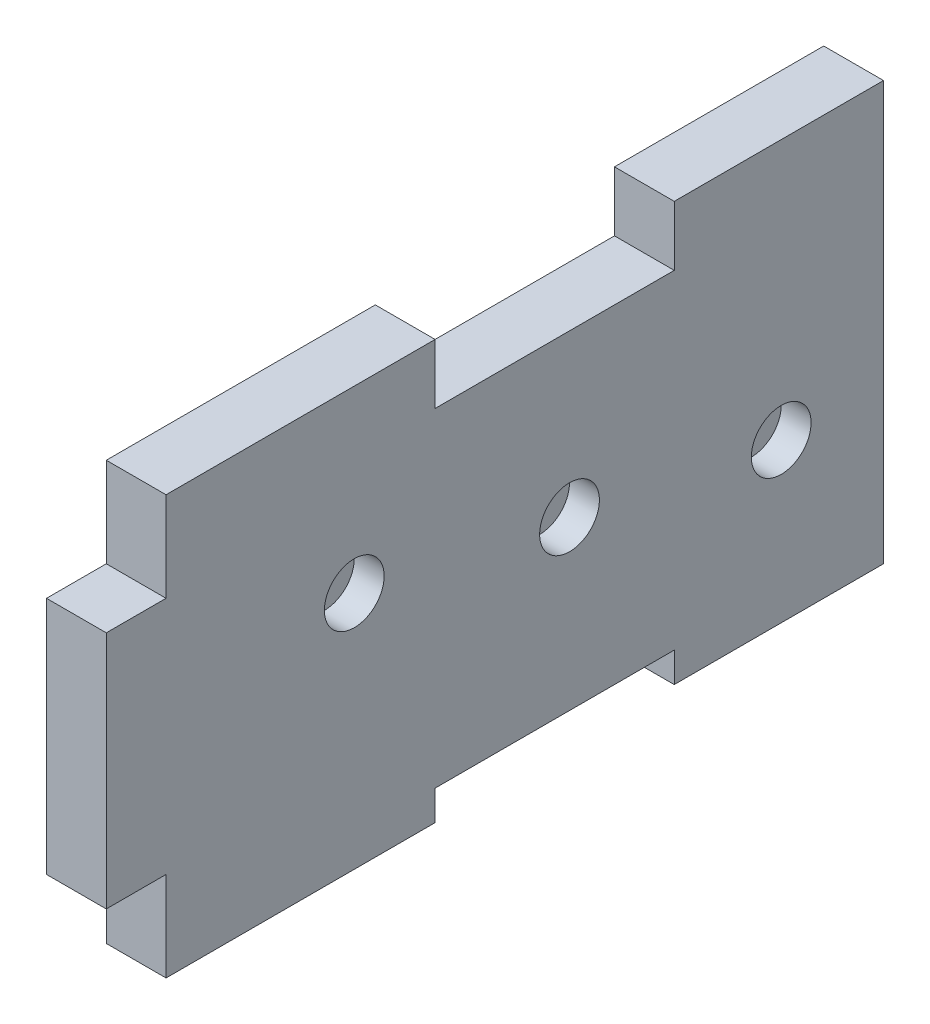
ISO-10303-21;
HEADER;
FILE_DESCRIPTION(('STEP AP214'),'2;1');
FILE_NAME('part.step','',(''),(''),'','','');
FILE_SCHEMA(('AUTOMOTIVE_DESIGN { 1 0 10303 214 1 1 1 1 }'));
ENDSEC;
DATA;
#1=APPLICATION_CONTEXT('core data for automotive mechanical design processes');
#2=APPLICATION_PROTOCOL_DEFINITION('international standard','automotive_design',2000,#1);
#3=PRODUCT_CONTEXT('',#1,'mechanical');
#4=PRODUCT('Part','Part','',(#3));
#5=PRODUCT_RELATED_PRODUCT_CATEGORY('part','',(#4));
#6=PRODUCT_DEFINITION_FORMATION('','',#4);
#7=PRODUCT_DEFINITION_CONTEXT('part definition',#1,'design');
#8=PRODUCT_DEFINITION('design','',#6,#7);
#9=PRODUCT_DEFINITION_SHAPE('','',#8);
#10=(LENGTH_UNIT() NAMED_UNIT(*) SI_UNIT(.MILLI.,.METRE.));
#11=(NAMED_UNIT(*) PLANE_ANGLE_UNIT() SI_UNIT($,.RADIAN.));
#12=(NAMED_UNIT(*) SI_UNIT($,.STERADIAN.) SOLID_ANGLE_UNIT());
#13=UNCERTAINTY_MEASURE_WITH_UNIT(LENGTH_MEASURE(1.E-05),#10,'distance_accuracy_value','');
#14=(GEOMETRIC_REPRESENTATION_CONTEXT(3) GLOBAL_UNCERTAINTY_ASSIGNED_CONTEXT((#13)) GLOBAL_UNIT_ASSIGNED_CONTEXT((#10,
#11,#12)) REPRESENTATION_CONTEXT('',''));
#15=CARTESIAN_POINT('',(0.,0.,0.));
#16=DIRECTION('',(0.,0.,1.));
#17=DIRECTION('',(1.,0.,0.));
#18=AXIS2_PLACEMENT_3D('',#15,#16,#17);
#19=CARTESIAN_POINT('',(5.,0.,35.));
#20=DIRECTION('',(0.,0.,1.));
#21=DIRECTION('',(1.,0.,0.));
#22=AXIS2_PLACEMENT_3D('',#19,#20,#21);
#23=PLANE('',#22);
#24=DIRECTION('',(-1.,0.,0.));
#25=VECTOR('',#24,1.);
#26=CARTESIAN_POINT('',(5.,5.00000000000002,35.));
#27=LINE('',#26,#25);
#28=CARTESIAN_POINT('',(5.,5.00000000000002,35.));
#29=VERTEX_POINT('',#28);
#30=CARTESIAN_POINT('',(-5.,5.00000000000002,35.));
#31=VERTEX_POINT('',#30);
#32=EDGE_CURVE('E158',#29,#31,#27,.T.);
#33=ORIENTED_EDGE('',*,*,#32,.T.);
#34=DIRECTION('',(0.,1.,0.));
#35=VECTOR('',#34,1.);
#36=CARTESIAN_POINT('',(-5.,0.,35.));
#37=LINE('',#36,#35);
#38=CARTESIAN_POINT('',(-5.,0.,35.));
#39=VERTEX_POINT('',#38);
#40=EDGE_CURVE('E157',#39,#31,#37,.T.);
#41=ORIENTED_EDGE('',*,*,#40,.F.);
#42=DIRECTION('',(-1.,0.,0.));
#43=VECTOR('',#42,1.);
#44=CARTESIAN_POINT('',(5.,0.,35.));
#45=LINE('',#44,#43);
#46=CARTESIAN_POINT('',(5.,0.,35.));
#47=VERTEX_POINT('',#46);
#48=EDGE_CURVE('E11',#47,#39,#45,.T.);
#49=ORIENTED_EDGE('',*,*,#48,.F.);
#50=DIRECTION('',(0.,1.,0.));
#51=VECTOR('',#50,1.);
#52=CARTESIAN_POINT('',(5.,0.,35.));
#53=LINE('',#52,#51);
#54=EDGE_CURVE('E220',#47,#29,#53,.T.);
#55=ORIENTED_EDGE('',*,*,#54,.T.);
#56=EDGE_LOOP('',(#33,#41,#49,#55));
#57=FACE_BOUND('',#56,.T.);
#58=ADVANCED_FACE('F37',(#57),#23,.T.);
#59=CARTESIAN_POINT('',(5.,0.,0.));
#60=DIRECTION('',(0.,1.,0.));
#61=DIRECTION('',(0.,0.,1.));
#62=AXIS2_PLACEMENT_3D('',#59,#60,#61);
#63=PLANE('',#62);
#64=ORIENTED_EDGE('',*,*,#48,.T.);
#65=DIRECTION('',(0.,0.,1.));
#66=VECTOR('',#65,1.);
#67=CARTESIAN_POINT('',(-5.,0.,0.));
#68=LINE('',#67,#66);
#69=CARTESIAN_POINT('',(-5.,0.,0.));
#70=VERTEX_POINT('',#69);
#71=EDGE_CURVE('E152',#70,#39,#68,.T.);
#72=ORIENTED_EDGE('',*,*,#71,.F.);
#73=DIRECTION('',(-1.,0.,0.));
#74=VECTOR('',#73,1.);
#75=CARTESIAN_POINT('',(5.,0.,0.));
#76=LINE('',#75,#74);
#77=CARTESIAN_POINT('',(5.,0.,0.));
#78=VERTEX_POINT('',#77);
#79=EDGE_CURVE('E44',#78,#70,#76,.T.);
#80=ORIENTED_EDGE('',*,*,#79,.F.);
#81=DIRECTION('',(0.,0.,-1.));
#82=VECTOR('',#81,1.);
#83=CARTESIAN_POINT('',(5.,0.,0.));
#84=LINE('',#83,#82);
#85=EDGE_CURVE('E153',#47,#78,#84,.T.);
#86=ORIENTED_EDGE('',*,*,#85,.F.);
#87=EDGE_LOOP('',(#64,#72,#80,#86));
#88=FACE_BOUND('',#87,.T.);
#89=ADVANCED_FACE('F149',(#88),#63,.F.);
#90=CARTESIAN_POINT('',(5.,0.,0.));
#91=DIRECTION('',(0.,0.,-1.));
#92=DIRECTION('',(0.,1.,0.));
#93=AXIS2_PLACEMENT_3D('',#90,#91,#92);
#94=PLANE('',#93);
#95=ORIENTED_EDGE('',*,*,#79,.T.);
#96=DIRECTION('',(0.,-1.,0.));
#97=VECTOR('',#96,1.);
#98=CARTESIAN_POINT('',(-5.,70.,0.));
#99=LINE('',#98,#97);
#100=CARTESIAN_POINT('',(-5.,70.,0.));
#101=VERTEX_POINT('',#100);
#102=EDGE_CURVE('E168',#101,#70,#99,.T.);
#103=ORIENTED_EDGE('',*,*,#102,.F.);
#104=DIRECTION('',(-1.,0.,0.));
#105=VECTOR('',#104,1.);
#106=CARTESIAN_POINT('',(5.,70.,0.));
#107=LINE('',#106,#105);
#108=CARTESIAN_POINT('',(5.,70.,0.));
#109=VERTEX_POINT('',#108);
#110=EDGE_CURVE('E284',#109,#101,#107,.T.);
#111=ORIENTED_EDGE('',*,*,#110,.F.);
#112=DIRECTION('',(0.,-1.,0.));
#113=VECTOR('',#112,1.);
#114=CARTESIAN_POINT('',(5.,0.,0.));
#115=LINE('',#114,#113);
#116=EDGE_CURVE('E229',#109,#78,#115,.T.);
#117=ORIENTED_EDGE('',*,*,#116,.T.);
#118=EDGE_LOOP('',(#95,#103,#111,#117));
#119=FACE_BOUND('',#118,.T.);
#120=ADVANCED_FACE('F286',(#119),#94,.T.);
#121=CARTESIAN_POINT('',(5.,70.,0.));
#122=DIRECTION('',(0.,1.,0.));
#123=DIRECTION('',(0.,0.,1.));
#124=AXIS2_PLACEMENT_3D('',#121,#122,#123);
#125=PLANE('',#124);
#126=ORIENTED_EDGE('',*,*,#110,.T.);
#127=DIRECTION('',(0.,0.,-1.));
#128=VECTOR('',#127,1.);
#129=CARTESIAN_POINT('',(-5.,70.,35.));
#130=LINE('',#129,#128);
#131=CARTESIAN_POINT('',(-5.,70.,35.));
#132=VERTEX_POINT('',#131);
#133=EDGE_CURVE('E205',#132,#101,#130,.T.);
#134=ORIENTED_EDGE('',*,*,#133,.F.);
#135=DIRECTION('',(-1.,0.,0.));
#136=VECTOR('',#135,1.);
#137=CARTESIAN_POINT('',(5.,70.,35.));
#138=LINE('',#137,#136);
#139=CARTESIAN_POINT('',(5.,70.,35.));
#140=VERTEX_POINT('',#139);
#141=EDGE_CURVE('E282',#140,#132,#138,.T.);
#142=ORIENTED_EDGE('',*,*,#141,.F.);
#143=DIRECTION('',(0.,0.,-1.));
#144=VECTOR('',#143,1.);
#145=CARTESIAN_POINT('',(5.,70.,0.));
#146=LINE('',#145,#144);
#147=EDGE_CURVE('E233',#140,#109,#146,.T.);
#148=ORIENTED_EDGE('',*,*,#147,.T.);
#149=EDGE_LOOP('',(#126,#134,#142,#148));
#150=FACE_BOUND('',#149,.T.);
#151=ADVANCED_FACE('F291',(#150),#125,.T.);
#152=CARTESIAN_POINT('',(5.,0.,35.));
#153=DIRECTION('',(0.,0.,-1.));
#154=DIRECTION('',(-1.,0.,0.));
#155=AXIS2_PLACEMENT_3D('',#152,#153,#154);
#156=PLANE('',#155);
#157=ORIENTED_EDGE('',*,*,#141,.T.);
#158=DIRECTION('',(0.,1.,0.));
#159=VECTOR('',#158,1.);
#160=CARTESIAN_POINT('',(-5.,60.,35.));
#161=LINE('',#160,#159);
#162=CARTESIAN_POINT('',(-5.,60.,35.));
#163=VERTEX_POINT('',#162);
#164=EDGE_CURVE('E202',#163,#132,#161,.T.);
#165=ORIENTED_EDGE('',*,*,#164,.F.);
#166=DIRECTION('',(-1.,0.,0.));
#167=VECTOR('',#166,1.);
#168=CARTESIAN_POINT('',(5.,60.,35.));
#169=LINE('',#168,#167);
#170=CARTESIAN_POINT('',(5.,60.,35.));
#171=VERTEX_POINT('',#170);
#172=EDGE_CURVE('E280',#171,#163,#169,.T.);
#173=ORIENTED_EDGE('',*,*,#172,.F.);
#174=DIRECTION('',(0.,-1.,0.));
#175=VECTOR('',#174,1.);
#176=CARTESIAN_POINT('',(5.,0.,35.));
#177=LINE('',#176,#175);
#178=EDGE_CURVE('E236',#140,#171,#177,.T.);
#179=ORIENTED_EDGE('',*,*,#178,.F.);
#180=EDGE_LOOP('',(#157,#165,#173,#179));
#181=FACE_BOUND('',#180,.T.);
#182=ADVANCED_FACE('F297',(#181),#156,.F.);
#183=CARTESIAN_POINT('',(5.,60.,0.));
#184=DIRECTION('',(0.,1.,0.));
#185=DIRECTION('',(0.,0.,1.));
#186=AXIS2_PLACEMENT_3D('',#183,#184,#185);
#187=PLANE('',#186);
#188=ORIENTED_EDGE('',*,*,#172,.T.);
#189=DIRECTION('',(0.,0.,-1.));
#190=VECTOR('',#189,1.);
#191=CARTESIAN_POINT('',(-5.,60.,75.));
#192=LINE('',#191,#190);
#193=CARTESIAN_POINT('',(-5.,60.,75.));
#194=VERTEX_POINT('',#193);
#195=EDGE_CURVE('E199',#194,#163,#192,.T.);
#196=ORIENTED_EDGE('',*,*,#195,.F.);
#197=DIRECTION('',(-1.,0.,0.));
#198=VECTOR('',#197,1.);
#199=CARTESIAN_POINT('',(5.,60.,75.));
#200=LINE('',#199,#198);
#201=CARTESIAN_POINT('',(5.,60.,75.));
#202=VERTEX_POINT('',#201);
#203=EDGE_CURVE('E278',#202,#194,#200,.T.);
#204=ORIENTED_EDGE('',*,*,#203,.F.);
#205=DIRECTION('',(0.,0.,-1.));
#206=VECTOR('',#205,1.);
#207=CARTESIAN_POINT('',(5.,60.,0.));
#208=LINE('',#207,#206);
#209=EDGE_CURVE('E239',#202,#171,#208,.T.);
#210=ORIENTED_EDGE('',*,*,#209,.T.);
#211=EDGE_LOOP('',(#188,#196,#204,#210));
#212=FACE_BOUND('',#211,.T.);
#213=ADVANCED_FACE('F381',(#212),#187,.T.);
#214=CARTESIAN_POINT('',(5.,0.,75.));
#215=DIRECTION('',(0.,0.,-1.));
#216=DIRECTION('',(-1.,0.,0.));
#217=AXIS2_PLACEMENT_3D('',#214,#215,#216);
#218=PLANE('',#217);
#219=ORIENTED_EDGE('',*,*,#203,.T.);
#220=DIRECTION('',(0.,-1.,0.));
#221=VECTOR('',#220,1.);
#222=CARTESIAN_POINT('',(-5.,70.,75.));
#223=LINE('',#222,#221);
#224=CARTESIAN_POINT('',(-5.,70.,75.));
#225=VERTEX_POINT('',#224);
#226=EDGE_CURVE('E196',#225,#194,#223,.T.);
#227=ORIENTED_EDGE('',*,*,#226,.F.);
#228=DIRECTION('',(-1.,0.,0.));
#229=VECTOR('',#228,1.);
#230=CARTESIAN_POINT('',(5.,70.,75.));
#231=LINE('',#230,#229);
#232=CARTESIAN_POINT('',(5.,70.,75.));
#233=VERTEX_POINT('',#232);
#234=EDGE_CURVE('E276',#233,#225,#231,.T.);
#235=ORIENTED_EDGE('',*,*,#234,.F.);
#236=DIRECTION('',(0.,-1.,0.));
#237=VECTOR('',#236,1.);
#238=CARTESIAN_POINT('',(5.,0.,75.));
#239=LINE('',#238,#237);
#240=EDGE_CURVE('E242',#233,#202,#239,.T.);
#241=ORIENTED_EDGE('',*,*,#240,.T.);
#242=EDGE_LOOP('',(#219,#227,#235,#241));
#243=FACE_BOUND('',#242,.T.);
#244=ADVANCED_FACE('F304',(#243),#218,.T.);
#245=ORIENTED_EDGE('',*,*,#234,.T.);
#246=DIRECTION('',(0.,0.,-1.));
#247=VECTOR('',#246,1.);
#248=CARTESIAN_POINT('',(-5.,70.,120.));
#249=LINE('',#248,#247);
#250=CARTESIAN_POINT('',(-5.,70.,120.));
#251=VERTEX_POINT('',#250);
#252=EDGE_CURVE('E193',#251,#225,#249,.T.);
#253=ORIENTED_EDGE('',*,*,#252,.F.);
#254=DIRECTION('',(-1.,0.,0.));
#255=VECTOR('',#254,1.);
#256=CARTESIAN_POINT('',(5.,70.,120.));
#257=LINE('',#256,#255);
#258=CARTESIAN_POINT('',(5.,70.,120.));
#259=VERTEX_POINT('',#258);
#260=EDGE_CURVE('E274',#259,#251,#257,.T.);
#261=ORIENTED_EDGE('',*,*,#260,.F.);
#262=EDGE_CURVE('E237',#259,#233,#146,.T.);
#263=ORIENTED_EDGE('',*,*,#262,.T.);
#264=EDGE_LOOP('',(#245,#253,#261,#263));
#265=FACE_BOUND('',#264,.T.);
#266=ADVANCED_FACE('F308',(#265),#125,.T.);
#267=CARTESIAN_POINT('',(5.,1.11022302462516E-13,120.));
#268=DIRECTION('',(0.,0.,-1.));
#269=DIRECTION('',(0.,1.,0.));
#270=AXIS2_PLACEMENT_3D('',#267,#268,#269);
#271=PLANE('',#270);
#272=ORIENTED_EDGE('',*,*,#260,.T.);
#273=DIRECTION('',(0.,1.,0.));
#274=VECTOR('',#273,1.);
#275=CARTESIAN_POINT('',(-5.,55.,120.));
#276=LINE('',#275,#274);
#277=CARTESIAN_POINT('',(-5.,55.,120.));
#278=VERTEX_POINT('',#277);
#279=EDGE_CURVE('E190',#278,#251,#276,.T.);
#280=ORIENTED_EDGE('',*,*,#279,.F.);
#281=DIRECTION('',(-1.,0.,0.));
#282=VECTOR('',#281,1.);
#283=CARTESIAN_POINT('',(5.,55.,120.));
#284=LINE('',#283,#282);
#285=CARTESIAN_POINT('',(5.,55.,120.));
#286=VERTEX_POINT('',#285);
#287=EDGE_CURVE('E272',#286,#278,#284,.T.);
#288=ORIENTED_EDGE('',*,*,#287,.F.);
#289=DIRECTION('',(0.,-1.,0.));
#290=VECTOR('',#289,1.);
#291=CARTESIAN_POINT('',(5.,1.11022302462516E-13,120.));
#292=LINE('',#291,#290);
#293=EDGE_CURVE('E245',#259,#286,#292,.T.);
#294=ORIENTED_EDGE('',*,*,#293,.F.);
#295=EDGE_LOOP('',(#272,#280,#288,#294));
#296=FACE_BOUND('',#295,.T.);
#297=ADVANCED_FACE('F314',(#296),#271,.F.);
#298=CARTESIAN_POINT('',(5.,54.9999999999999,0.));
#299=DIRECTION('',(0.,1.,0.));
#300=DIRECTION('',(0.,0.,1.));
#301=AXIS2_PLACEMENT_3D('',#298,#299,#300);
#302=PLANE('',#301);
#303=ORIENTED_EDGE('',*,*,#287,.T.);
#304=DIRECTION('',(0.,0.,-1.));
#305=VECTOR('',#304,1.);
#306=CARTESIAN_POINT('',(-5.,55.,130.));
#307=LINE('',#306,#305);
#308=CARTESIAN_POINT('',(-5.,55.,130.));
#309=VERTEX_POINT('',#308);
#310=EDGE_CURVE('E187',#309,#278,#307,.T.);
#311=ORIENTED_EDGE('',*,*,#310,.F.);
#312=DIRECTION('',(-1.,0.,0.));
#313=VECTOR('',#312,1.);
#314=CARTESIAN_POINT('',(5.,55.,130.));
#315=LINE('',#314,#313);
#316=CARTESIAN_POINT('',(5.,55.,130.));
#317=VERTEX_POINT('',#316);
#318=EDGE_CURVE('E270',#317,#309,#315,.T.);
#319=ORIENTED_EDGE('',*,*,#318,.F.);
#320=DIRECTION('',(0.,0.,-1.));
#321=VECTOR('',#320,1.);
#322=CARTESIAN_POINT('',(5.,54.9999999999999,0.));
#323=LINE('',#322,#321);
#324=EDGE_CURVE('E247',#317,#286,#323,.T.);
#325=ORIENTED_EDGE('',*,*,#324,.T.);
#326=EDGE_LOOP('',(#303,#311,#319,#325));
#327=FACE_BOUND('',#326,.T.);
#328=ADVANCED_FACE('F320',(#327),#302,.T.);
#329=CARTESIAN_POINT('',(5.,0.,130.));
#330=DIRECTION('',(0.,0.,-1.));
#331=DIRECTION('',(0.,1.,0.));
#332=AXIS2_PLACEMENT_3D('',#329,#330,#331);
#333=PLANE('',#332);
#334=ORIENTED_EDGE('',*,*,#318,.T.);
#335=DIRECTION('',(0.,1.,0.));
#336=VECTOR('',#335,1.);
#337=CARTESIAN_POINT('',(-5.,15.,130.));
#338=LINE('',#337,#336);
#339=CARTESIAN_POINT('',(-5.,15.,130.));
#340=VERTEX_POINT('',#339);
#341=EDGE_CURVE('E184',#340,#309,#338,.T.);
#342=ORIENTED_EDGE('',*,*,#341,.F.);
#343=DIRECTION('',(-1.,0.,0.));
#344=VECTOR('',#343,1.);
#345=CARTESIAN_POINT('',(5.,15.,130.));
#346=LINE('',#345,#344);
#347=CARTESIAN_POINT('',(5.,15.,130.));
#348=VERTEX_POINT('',#347);
#349=EDGE_CURVE('E268',#348,#340,#346,.T.);
#350=ORIENTED_EDGE('',*,*,#349,.F.);
#351=DIRECTION('',(0.,-1.,0.));
#352=VECTOR('',#351,1.);
#353=CARTESIAN_POINT('',(5.,0.,130.));
#354=LINE('',#353,#352);
#355=EDGE_CURVE('E250',#317,#348,#354,.T.);
#356=ORIENTED_EDGE('',*,*,#355,.F.);
#357=EDGE_LOOP('',(#334,#342,#350,#356));
#358=FACE_BOUND('',#357,.T.);
#359=ADVANCED_FACE('F323',(#358),#333,.F.);
#360=CARTESIAN_POINT('',(5.,15.,0.));
#361=DIRECTION('',(0.,1.,0.));
#362=DIRECTION('',(0.,0.,1.));
#363=AXIS2_PLACEMENT_3D('',#360,#361,#362);
#364=PLANE('',#363);
#365=ORIENTED_EDGE('',*,*,#349,.T.);
#366=DIRECTION('',(0.,0.,1.));
#367=VECTOR('',#366,1.);
#368=CARTESIAN_POINT('',(-5.,15.,120.));
#369=LINE('',#368,#367);
#370=CARTESIAN_POINT('',(-5.,15.,120.));
#371=VERTEX_POINT('',#370);
#372=EDGE_CURVE('E181',#371,#340,#369,.T.);
#373=ORIENTED_EDGE('',*,*,#372,.F.);
#374=DIRECTION('',(-1.,0.,0.));
#375=VECTOR('',#374,1.);
#376=CARTESIAN_POINT('',(5.,15.,120.));
#377=LINE('',#376,#375);
#378=CARTESIAN_POINT('',(5.,15.,120.));
#379=VERTEX_POINT('',#378);
#380=EDGE_CURVE('E266',#379,#371,#377,.T.);
#381=ORIENTED_EDGE('',*,*,#380,.F.);
#382=DIRECTION('',(0.,0.,-1.));
#383=VECTOR('',#382,1.);
#384=CARTESIAN_POINT('',(5.,15.,0.));
#385=LINE('',#384,#383);
#386=EDGE_CURVE('E252',#348,#379,#385,.T.);
#387=ORIENTED_EDGE('',*,*,#386,.F.);
#388=EDGE_LOOP('',(#365,#373,#381,#387));
#389=FACE_BOUND('',#388,.T.);
#390=ADVANCED_FACE('F328',(#389),#364,.F.);
#391=CARTESIAN_POINT('',(5.,0.,120.));
#392=DIRECTION('',(0.,0.,1.));
#393=DIRECTION('',(1.,0.,0.));
#394=AXIS2_PLACEMENT_3D('',#391,#392,#393);
#395=PLANE('',#394);
#396=ORIENTED_EDGE('',*,*,#380,.T.);
#397=DIRECTION('',(0.,1.,0.));
#398=VECTOR('',#397,1.);
#399=CARTESIAN_POINT('',(-5.,0.,120.));
#400=LINE('',#399,#398);
#401=CARTESIAN_POINT('',(-5.,0.,120.));
#402=VERTEX_POINT('',#401);
#403=EDGE_CURVE('E178',#402,#371,#400,.T.);
#404=ORIENTED_EDGE('',*,*,#403,.F.);
#405=DIRECTION('',(-1.,0.,0.));
#406=VECTOR('',#405,1.);
#407=CARTESIAN_POINT('',(5.,0.,120.));
#408=LINE('',#407,#406);
#409=CARTESIAN_POINT('',(5.,0.,120.));
#410=VERTEX_POINT('',#409);
#411=EDGE_CURVE('E264',#410,#402,#408,.T.);
#412=ORIENTED_EDGE('',*,*,#411,.F.);
#413=DIRECTION('',(0.,1.,0.));
#414=VECTOR('',#413,1.);
#415=CARTESIAN_POINT('',(5.,0.,120.));
#416=LINE('',#415,#414);
#417=EDGE_CURVE('E254',#410,#379,#416,.T.);
#418=ORIENTED_EDGE('',*,*,#417,.T.);
#419=EDGE_LOOP('',(#396,#404,#412,#418));
#420=FACE_BOUND('',#419,.T.);
#421=ADVANCED_FACE('F333',(#420),#395,.T.);
#422=ORIENTED_EDGE('',*,*,#411,.T.);
#423=DIRECTION('',(0.,0.,1.));
#424=VECTOR('',#423,1.);
#425=CARTESIAN_POINT('',(-5.,0.,75.));
#426=LINE('',#425,#424);
#427=CARTESIAN_POINT('',(-5.,0.,75.));
#428=VERTEX_POINT('',#427);
#429=EDGE_CURVE('E175',#428,#402,#426,.T.);
#430=ORIENTED_EDGE('',*,*,#429,.F.);
#431=DIRECTION('',(-1.,0.,0.));
#432=VECTOR('',#431,1.);
#433=CARTESIAN_POINT('',(5.,0.,75.));
#434=LINE('',#433,#432);
#435=CARTESIAN_POINT('',(5.,0.,75.));
#436=VERTEX_POINT('',#435);
#437=EDGE_CURVE('E262',#436,#428,#434,.T.);
#438=ORIENTED_EDGE('',*,*,#437,.F.);
#439=EDGE_CURVE('E230',#410,#436,#84,.T.);
#440=ORIENTED_EDGE('',*,*,#439,.F.);
#441=EDGE_LOOP('',(#422,#430,#438,#440));
#442=FACE_BOUND('',#441,.T.);
#443=ADVANCED_FACE('F337',(#442),#63,.F.);
#444=CARTESIAN_POINT('',(5.,0.,75.));
#445=DIRECTION('',(0.,0.,1.));
#446=DIRECTION('',(1.,0.,0.));
#447=AXIS2_PLACEMENT_3D('',#444,#445,#446);
#448=PLANE('',#447);
#449=ORIENTED_EDGE('',*,*,#437,.T.);
#450=DIRECTION('',(0.,-1.,0.));
#451=VECTOR('',#450,1.);
#452=CARTESIAN_POINT('',(-5.,5.00000000000002,75.));
#453=LINE('',#452,#451);
#454=CARTESIAN_POINT('',(-5.,5.00000000000002,75.));
#455=VERTEX_POINT('',#454);
#456=EDGE_CURVE('E172',#455,#428,#453,.T.);
#457=ORIENTED_EDGE('',*,*,#456,.F.);
#458=DIRECTION('',(-1.,0.,0.));
#459=VECTOR('',#458,1.);
#460=CARTESIAN_POINT('',(5.,5.00000000000002,75.));
#461=LINE('',#460,#459);
#462=CARTESIAN_POINT('',(5.,5.00000000000002,75.));
#463=VERTEX_POINT('',#462);
#464=EDGE_CURVE('E260',#463,#455,#461,.T.);
#465=ORIENTED_EDGE('',*,*,#464,.F.);
#466=DIRECTION('',(0.,1.,0.));
#467=VECTOR('',#466,1.);
#468=CARTESIAN_POINT('',(5.,0.,75.));
#469=LINE('',#468,#467);
#470=EDGE_CURVE('E56',#436,#463,#469,.T.);
#471=ORIENTED_EDGE('',*,*,#470,.F.);
#472=EDGE_LOOP('',(#449,#457,#465,#471));
#473=FACE_BOUND('',#472,.T.);
#474=ADVANCED_FACE('F340',(#473),#448,.F.);
#475=CARTESIAN_POINT('',(5.,5.00000000000002,0.));
#476=DIRECTION('',(0.,1.,0.));
#477=DIRECTION('',(0.,0.,1.));
#478=AXIS2_PLACEMENT_3D('',#475,#476,#477);
#479=PLANE('',#478);
#480=ORIENTED_EDGE('',*,*,#464,.T.);
#481=DIRECTION('',(0.,0.,1.));
#482=VECTOR('',#481,1.);
#483=CARTESIAN_POINT('',(-5.,5.00000000000002,35.));
#484=LINE('',#483,#482);
#485=EDGE_CURVE('E162',#31,#455,#484,.T.);
#486=ORIENTED_EDGE('',*,*,#485,.F.);
#487=ORIENTED_EDGE('',*,*,#32,.F.);
#488=DIRECTION('',(0.,0.,-1.));
#489=VECTOR('',#488,1.);
#490=CARTESIAN_POINT('',(5.,5.00000000000002,0.));
#491=LINE('',#490,#489);
#492=EDGE_CURVE('E51',#463,#29,#491,.T.);
#493=ORIENTED_EDGE('',*,*,#492,.F.);
#494=EDGE_LOOP('',(#480,#486,#487,#493));
#495=FACE_BOUND('',#494,.T.);
#496=ADVANCED_FACE('F342',(#495),#479,.F.);
#497=CARTESIAN_POINT('',(5.,0.,0.));
#498=DIRECTION('',(1.,0.,0.));
#499=DIRECTION('',(0.,0.,-1.));
#500=AXIS2_PLACEMENT_3D('',#497,#498,#499);
#501=PLANE('',#500);
#502=CARTESIAN_POINT('',(5.,40.,88.52));
#503=DIRECTION('',(1.,0.,0.));
#504=DIRECTION('',(0.,0.,-1.));
#505=AXIS2_PLACEMENT_3D('',#502,#503,#504);
#506=CIRCLE('',#505,5.00000000000001);
#507=CARTESIAN_POINT('',(5.,40.,83.52));
#508=VERTEX_POINT('',#507);
#509=EDGE_CURVE('E213',#508,#508,#506,.T.);
#510=ORIENTED_EDGE('',*,*,#509,.F.);
#511=EDGE_LOOP('',(#510));
#512=FACE_BOUND('',#511,.T.);
#513=CARTESIAN_POINT('',(5.,26.5,17.1116676472895));
#514=DIRECTION('',(-1.,0.,0.));
#515=DIRECTION('',(0.,0.,1.));
#516=AXIS2_PLACEMENT_3D('',#513,#514,#515);
#517=CIRCLE('',#516,4.99999999999999);
#518=CARTESIAN_POINT('',(5.,26.5,22.1116676472895));
#519=VERTEX_POINT('',#518);
#520=EDGE_CURVE('E217',#519,#519,#517,.T.);
#521=ORIENTED_EDGE('',*,*,#520,.T.);
#522=EDGE_LOOP('',(#521));
#523=FACE_BOUND('',#522,.T.);
#524=CARTESIAN_POINT('',(5.,33.,52.52));
#525=DIRECTION('',(-1.,0.,0.));
#526=DIRECTION('',(0.,0.,1.));
#527=AXIS2_PLACEMENT_3D('',#524,#525,#526);
#528=CIRCLE('',#527,4.99999999999999);
#529=CARTESIAN_POINT('',(5.,33.,57.52));
#530=VERTEX_POINT('',#529);
#531=EDGE_CURVE('E212',#530,#530,#528,.T.);
#532=ORIENTED_EDGE('',*,*,#531,.T.);
#533=EDGE_LOOP('',(#532));
#534=FACE_BOUND('',#533,.T.);
#535=ORIENTED_EDGE('',*,*,#54,.F.);
#536=ORIENTED_EDGE('',*,*,#85,.T.);
#537=ORIENTED_EDGE('',*,*,#116,.F.);
#538=ORIENTED_EDGE('',*,*,#147,.F.);
#539=ORIENTED_EDGE('',*,*,#178,.T.);
#540=ORIENTED_EDGE('',*,*,#209,.F.);
#541=ORIENTED_EDGE('',*,*,#240,.F.);
#542=ORIENTED_EDGE('',*,*,#262,.F.);
#543=ORIENTED_EDGE('',*,*,#293,.T.);
#544=ORIENTED_EDGE('',*,*,#324,.F.);
#545=ORIENTED_EDGE('',*,*,#355,.T.);
#546=ORIENTED_EDGE('',*,*,#386,.T.);
#547=ORIENTED_EDGE('',*,*,#417,.F.);
#548=ORIENTED_EDGE('',*,*,#439,.T.);
#549=ORIENTED_EDGE('',*,*,#470,.T.);
#550=ORIENTED_EDGE('',*,*,#492,.T.);
#551=EDGE_LOOP('',(#535,#536,#537,#538,#539,#540,#541,#542,#543,#544,#545,#546,#547,#548,#549,#550));
#552=FACE_BOUND('',#551,.T.);
#553=ADVANCED_FACE('F289',(#512,#523,#534,#552),#501,.T.);
#554=CARTESIAN_POINT('',(5.,33.,52.52));
#555=DIRECTION('',(-1.,0.,0.));
#556=DIRECTION('',(0.,0.,1.));
#557=AXIS2_PLACEMENT_3D('',#554,#555,#556);
#558=CYLINDRICAL_SURFACE('',#557,4.99999999999999);
#559=ORIENTED_EDGE('',*,*,#531,.F.);
#560=EDGE_LOOP('',(#559));
#561=FACE_BOUND('',#560,.T.);
#562=CARTESIAN_POINT('',(0.,33.,52.52));
#563=DIRECTION('',(-1.,0.,0.));
#564=DIRECTION('',(0.,0.,1.));
#565=AXIS2_PLACEMENT_3D('',#562,#563,#564);
#566=CIRCLE('',#565,4.99999999999999);
#567=CARTESIAN_POINT('',(0.,33.,57.52));
#568=VERTEX_POINT('',#567);
#569=EDGE_CURVE('E208',#568,#568,#566,.T.);
#570=ORIENTED_EDGE('',*,*,#569,.T.);
#571=EDGE_LOOP('',(#570));
#572=FACE_BOUND('',#571,.T.);
#573=ADVANCED_FACE('F349',(#561,#572),#558,.F.);
#574=CARTESIAN_POINT('',(5.,26.5,17.1116676472895));
#575=DIRECTION('',(-1.,0.,0.));
#576=DIRECTION('',(0.,0.,1.));
#577=AXIS2_PLACEMENT_3D('',#574,#575,#576);
#578=CYLINDRICAL_SURFACE('',#577,4.99999999999999);
#579=ORIENTED_EDGE('',*,*,#520,.F.);
#580=EDGE_LOOP('',(#579));
#581=FACE_BOUND('',#580,.T.);
#582=CARTESIAN_POINT('',(0.,26.5,17.1116676472895));
#583=DIRECTION('',(-1.,0.,0.));
#584=DIRECTION('',(0.,0.,1.));
#585=AXIS2_PLACEMENT_3D('',#582,#583,#584);
#586=CIRCLE('',#585,4.99999999999999);
#587=CARTESIAN_POINT('',(0.,26.5,22.1116676472895));
#588=VERTEX_POINT('',#587);
#589=EDGE_CURVE('E216',#588,#588,#586,.T.);
#590=ORIENTED_EDGE('',*,*,#589,.T.);
#591=EDGE_LOOP('',(#590));
#592=FACE_BOUND('',#591,.T.);
#593=ADVANCED_FACE('F416',(#581,#592),#578,.F.);
#594=CARTESIAN_POINT('',(0.,40.,88.52));
#595=DIRECTION('',(1.,0.,0.));
#596=DIRECTION('',(0.,0.,-1.));
#597=AXIS2_PLACEMENT_3D('',#594,#595,#596);
#598=CYLINDRICAL_SURFACE('',#597,5.00000000000001);
#599=CARTESIAN_POINT('',(0.,40.,88.52));
#600=DIRECTION('',(1.,0.,0.));
#601=DIRECTION('',(0.,0.,-1.));
#602=AXIS2_PLACEMENT_3D('',#599,#600,#601);
#603=CIRCLE('',#602,5.00000000000001);
#604=CARTESIAN_POINT('',(0.,40.,83.52));
#605=VERTEX_POINT('',#604);
#606=EDGE_CURVE('E209',#605,#605,#603,.T.);
#607=ORIENTED_EDGE('',*,*,#606,.F.);
#608=EDGE_LOOP('',(#607));
#609=FACE_BOUND('',#608,.T.);
#610=ORIENTED_EDGE('',*,*,#509,.T.);
#611=EDGE_LOOP('',(#610));
#612=FACE_BOUND('',#611,.T.);
#613=ADVANCED_FACE('F411',(#609,#612),#598,.F.);
#614=CARTESIAN_POINT('',(0.,0.,0.));
#615=DIRECTION('',(-1.,0.,0.));
#616=DIRECTION('',(0.,0.,1.));
#617=AXIS2_PLACEMENT_3D('',#614,#615,#616);
#618=PLANE('',#617);
#619=ORIENTED_EDGE('',*,*,#569,.F.);
#620=EDGE_LOOP('',(#619));
#621=FACE_BOUND('',#620,.T.);
#622=ADVANCED_FACE('F415',(#621),#618,.F.);
#623=ORIENTED_EDGE('',*,*,#589,.F.);
#624=EDGE_LOOP('',(#623));
#625=FACE_BOUND('',#624,.T.);
#626=ADVANCED_FACE('F453',(#625),#618,.F.);
#627=ORIENTED_EDGE('',*,*,#606,.T.);
#628=EDGE_LOOP('',(#627));
#629=FACE_BOUND('',#628,.T.);
#630=ADVANCED_FACE('F450',(#629),#618,.F.);
#631=CARTESIAN_POINT('',(-5.,0.,0.));
#632=DIRECTION('',(-1.,0.,0.));
#633=DIRECTION('',(0.,0.,1.));
#634=AXIS2_PLACEMENT_3D('',#631,#632,#633);
#635=PLANE('',#634);
#636=ORIENTED_EDGE('',*,*,#71,.T.);
#637=ORIENTED_EDGE('',*,*,#40,.T.);
#638=ORIENTED_EDGE('',*,*,#485,.T.);
#639=ORIENTED_EDGE('',*,*,#456,.T.);
#640=ORIENTED_EDGE('',*,*,#429,.T.);
#641=ORIENTED_EDGE('',*,*,#403,.T.);
#642=ORIENTED_EDGE('',*,*,#372,.T.);
#643=ORIENTED_EDGE('',*,*,#341,.T.);
#644=ORIENTED_EDGE('',*,*,#310,.T.);
#645=ORIENTED_EDGE('',*,*,#279,.T.);
#646=ORIENTED_EDGE('',*,*,#252,.T.);
#647=ORIENTED_EDGE('',*,*,#226,.T.);
#648=ORIENTED_EDGE('',*,*,#195,.T.);
#649=ORIENTED_EDGE('',*,*,#164,.T.);
#650=ORIENTED_EDGE('',*,*,#133,.T.);
#651=ORIENTED_EDGE('',*,*,#102,.T.);
#652=EDGE_LOOP('',(#636,#637,#638,#639,#640,#641,#642,#643,#644,#645,#646,#647,#648,#649,#650,#651));
#653=FACE_BOUND('',#652,.T.);
#654=ADVANCED_FACE('F165',(#653),#635,.T.);
#655=CLOSED_SHELL('',(#58,#89,#120,#151,#182,#213,#244,#266,#297,#328,#359,#390,#421,#443,#474,
#496,#553,#573,#593,#613,#622,#626,#630,#654));
#656=MANIFOLD_SOLID_BREP('B2',#655);
#657=ADVANCED_BREP_SHAPE_REPRESENTATION('',(#18,#656),#14);
#658=SHAPE_DEFINITION_REPRESENTATION(#9,#657);
ENDSEC;
END-ISO-10303-21;
